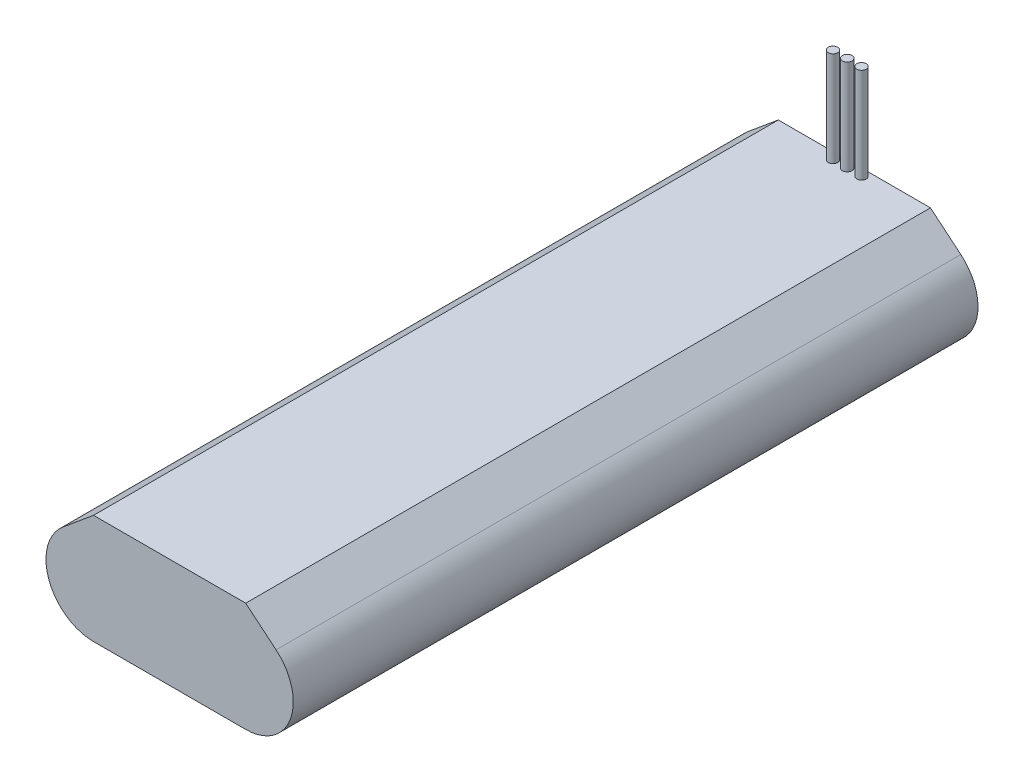
ISO-10303-21;
HEADER;
FILE_DESCRIPTION(('STEP AP214'),'2;1');
FILE_NAME('part.step','',(''),(''),'','','');
FILE_SCHEMA(('AUTOMOTIVE_DESIGN { 1 0 10303 214 1 1 1 1 }'));
ENDSEC;
DATA;
#1=APPLICATION_CONTEXT('core data for automotive mechanical design processes');
#2=APPLICATION_PROTOCOL_DEFINITION('international standard','automotive_design',2000,#1);
#3=PRODUCT_CONTEXT('',#1,'mechanical');
#4=PRODUCT('Part','Part','',(#3));
#5=PRODUCT_RELATED_PRODUCT_CATEGORY('part','',(#4));
#6=PRODUCT_DEFINITION_FORMATION('','',#4);
#7=PRODUCT_DEFINITION_CONTEXT('part definition',#1,'design');
#8=PRODUCT_DEFINITION('design','',#6,#7);
#9=PRODUCT_DEFINITION_SHAPE('','',#8);
#10=(LENGTH_UNIT() NAMED_UNIT(*) SI_UNIT(.MILLI.,.METRE.));
#11=(NAMED_UNIT(*) PLANE_ANGLE_UNIT() SI_UNIT($,.RADIAN.));
#12=(NAMED_UNIT(*) SI_UNIT($,.STERADIAN.) SOLID_ANGLE_UNIT());
#13=UNCERTAINTY_MEASURE_WITH_UNIT(LENGTH_MEASURE(1.E-05),#10,'distance_accuracy_value','');
#14=(GEOMETRIC_REPRESENTATION_CONTEXT(3) GLOBAL_UNCERTAINTY_ASSIGNED_CONTEXT((#13)) GLOBAL_UNIT_ASSIGNED_CONTEXT((#10,
#11,#12)) REPRESENTATION_CONTEXT('',''));
#15=CARTESIAN_POINT('',(0.,0.,0.));
#16=DIRECTION('',(0.,0.,1.));
#17=DIRECTION('',(1.,0.,0.));
#18=AXIS2_PLACEMENT_3D('',#15,#16,#17);
#19=CARTESIAN_POINT('',(-16.,0.,144.));
#20=DIRECTION('',(0.,0.,-1.));
#21=DIRECTION('',(-1.,0.,0.));
#22=AXIS2_PLACEMENT_3D('',#19,#20,#21);
#23=CYLINDRICAL_SURFACE('',#22,10.);
#24=CARTESIAN_POINT('',(-16.,0.,0.));
#25=DIRECTION('',(0.,0.,1.));
#26=DIRECTION('',(1.,0.,0.));
#27=AXIS2_PLACEMENT_3D('',#24,#25,#26);
#28=CIRCLE('',#27,10.);
#29=CARTESIAN_POINT('',(-22.3897106637831,7.69230769230769,0.));
#30=VERTEX_POINT('',#29);
#31=CARTESIAN_POINT('',(-16.,-10.,0.));
#32=VERTEX_POINT('',#31);
#33=EDGE_CURVE('E130',#30,#32,#28,.T.);
#34=ORIENTED_EDGE('',*,*,#33,.T.);
#35=DIRECTION('',(0.,0.,-1.));
#36=VECTOR('',#35,1.);
#37=CARTESIAN_POINT('',(-16.,-10.,144.));
#38=LINE('',#37,#36);
#39=CARTESIAN_POINT('',(-16.,-10.,144.));
#40=VERTEX_POINT('',#39);
#41=EDGE_CURVE('E148',#40,#32,#38,.T.);
#42=ORIENTED_EDGE('',*,*,#41,.F.);
#43=CARTESIAN_POINT('',(-16.,0.,144.));
#44=DIRECTION('',(0.,0.,1.));
#45=DIRECTION('',(1.,0.,0.));
#46=AXIS2_PLACEMENT_3D('',#43,#44,#45);
#47=CIRCLE('',#46,10.);
#48=CARTESIAN_POINT('',(-22.3897106637831,7.69230769230769,144.));
#49=VERTEX_POINT('',#48);
#50=EDGE_CURVE('E141',#49,#40,#47,.T.);
#51=ORIENTED_EDGE('',*,*,#50,.F.);
#52=DIRECTION('',(0.,0.,-1.));
#53=VECTOR('',#52,1.);
#54=CARTESIAN_POINT('',(-22.3897106637831,7.69230769230769,144.));
#55=LINE('',#54,#53);
#56=EDGE_CURVE('E126',#49,#30,#55,.T.);
#57=ORIENTED_EDGE('',*,*,#56,.T.);
#58=EDGE_LOOP('',(#34,#42,#51,#57));
#59=FACE_BOUND('',#58,.T.);
#60=ADVANCED_FACE('F45',(#59),#23,.T.);
#61=CARTESIAN_POINT('',(-16.,-10.,144.));
#62=DIRECTION('',(0.,1.,0.));
#63=DIRECTION('',(-1.,0.,0.));
#64=AXIS2_PLACEMENT_3D('',#61,#62,#63);
#65=PLANE('',#64);
#66=DIRECTION('',(1.,0.,0.));
#67=VECTOR('',#66,1.);
#68=CARTESIAN_POINT('',(-16.,-10.,0.));
#69=LINE('',#68,#67);
#70=CARTESIAN_POINT('',(16.,-9.99999999999999,0.));
#71=VERTEX_POINT('',#70);
#72=EDGE_CURVE('E133',#32,#71,#69,.T.);
#73=ORIENTED_EDGE('',*,*,#72,.T.);
#74=DIRECTION('',(0.,0.,-1.));
#75=VECTOR('',#74,1.);
#76=CARTESIAN_POINT('',(16.,-9.99999999999999,144.));
#77=LINE('',#76,#75);
#78=CARTESIAN_POINT('',(16.,-9.99999999999999,144.));
#79=VERTEX_POINT('',#78);
#80=EDGE_CURVE('E145',#79,#71,#77,.T.);
#81=ORIENTED_EDGE('',*,*,#80,.F.);
#82=DIRECTION('',(1.,0.,0.));
#83=VECTOR('',#82,1.);
#84=CARTESIAN_POINT('',(-16.,-10.,144.));
#85=LINE('',#84,#83);
#86=EDGE_CURVE('E99',#40,#79,#85,.T.);
#87=ORIENTED_EDGE('',*,*,#86,.F.);
#88=ORIENTED_EDGE('',*,*,#41,.T.);
#89=EDGE_LOOP('',(#73,#81,#87,#88));
#90=FACE_BOUND('',#89,.T.);
#91=ADVANCED_FACE('F181',(#90),#65,.F.);
#92=CARTESIAN_POINT('',(16.,0.,144.));
#93=DIRECTION('',(0.,0.,-1.));
#94=DIRECTION('',(-1.,0.,0.));
#95=AXIS2_PLACEMENT_3D('',#92,#93,#94);
#96=CYLINDRICAL_SURFACE('',#95,10.);
#97=CARTESIAN_POINT('',(16.,0.,0.));
#98=DIRECTION('',(0.,0.,1.));
#99=DIRECTION('',(1.,0.,0.));
#100=AXIS2_PLACEMENT_3D('',#97,#98,#99);
#101=CIRCLE('',#100,10.);
#102=CARTESIAN_POINT('',(22.3897130497335,7.69230571038786,0.));
#103=VERTEX_POINT('',#102);
#104=EDGE_CURVE('E136',#71,#103,#101,.T.);
#105=ORIENTED_EDGE('',*,*,#104,.T.);
#106=DIRECTION('',(0.,0.,-1.));
#107=VECTOR('',#106,1.);
#108=CARTESIAN_POINT('',(22.3897130497335,7.69230571038786,144.));
#109=LINE('',#108,#107);
#110=CARTESIAN_POINT('',(22.3897130497335,7.69230571038786,144.));
#111=VERTEX_POINT('',#110);
#112=EDGE_CURVE('E121',#111,#103,#109,.T.);
#113=ORIENTED_EDGE('',*,*,#112,.F.);
#114=CARTESIAN_POINT('',(16.,0.,144.));
#115=DIRECTION('',(0.,0.,1.));
#116=DIRECTION('',(1.,0.,0.));
#117=AXIS2_PLACEMENT_3D('',#114,#115,#116);
#118=CIRCLE('',#117,10.);
#119=EDGE_CURVE('E112',#79,#111,#118,.T.);
#120=ORIENTED_EDGE('',*,*,#119,.F.);
#121=ORIENTED_EDGE('',*,*,#80,.T.);
#122=EDGE_LOOP('',(#105,#113,#120,#121));
#123=FACE_BOUND('',#122,.T.);
#124=ADVANCED_FACE('F186',(#123),#96,.T.);
#125=CARTESIAN_POINT('',(16.0000040322559,13.,144.));
#126=DIRECTION('',(-0.638971304973349,-0.769230571038785,0.));
#127=DIRECTION('',(0.769230571038785,-0.638971304973349,0.));
#128=AXIS2_PLACEMENT_3D('',#125,#126,#127);
#129=PLANE('',#128);
#130=DIRECTION('',(-0.769230571038785,0.638971304973349,0.));
#131=VECTOR('',#130,1.);
#132=CARTESIAN_POINT('',(16.0000040322559,13.,0.));
#133=LINE('',#132,#131);
#134=CARTESIAN_POINT('',(16.0000040322559,13.,0.));
#135=VERTEX_POINT('',#134);
#136=EDGE_CURVE('E120',#103,#135,#133,.T.);
#137=ORIENTED_EDGE('',*,*,#136,.T.);
#138=DIRECTION('',(0.,0.,-1.));
#139=VECTOR('',#138,1.);
#140=CARTESIAN_POINT('',(16.0000040322559,13.,144.));
#141=LINE('',#140,#139);
#142=CARTESIAN_POINT('',(16.0000040322559,13.,144.));
#143=VERTEX_POINT('',#142);
#144=EDGE_CURVE('E117',#143,#135,#141,.T.);
#145=ORIENTED_EDGE('',*,*,#144,.F.);
#146=DIRECTION('',(-0.769230571038785,0.638971304973349,0.));
#147=VECTOR('',#146,1.);
#148=CARTESIAN_POINT('',(16.0000040322559,13.,144.));
#149=LINE('',#148,#147);
#150=EDGE_CURVE('E106',#111,#143,#149,.T.);
#151=ORIENTED_EDGE('',*,*,#150,.F.);
#152=ORIENTED_EDGE('',*,*,#112,.T.);
#153=EDGE_LOOP('',(#137,#145,#151,#152));
#154=FACE_BOUND('',#153,.T.);
#155=ADVANCED_FACE('F118',(#154),#129,.F.);
#156=CARTESIAN_POINT('',(-16.,13.,144.));
#157=DIRECTION('',(0.,-1.,0.));
#158=DIRECTION('',(0.,0.,-1.));
#159=AXIS2_PLACEMENT_3D('',#156,#157,#158);
#160=PLANE('',#159);
#161=CARTESIAN_POINT('',(3.,13.,1.5));
#162=DIRECTION('',(0.,-1.,0.));
#163=DIRECTION('',(0.,0.,-1.));
#164=AXIS2_PLACEMENT_3D('',#161,#162,#163);
#165=CIRCLE('',#164,1.);
#166=CARTESIAN_POINT('',(3.,13.,0.500000000000003));
#167=VERTEX_POINT('',#166);
#168=EDGE_CURVE('E11',#167,#167,#165,.F.);
#169=ORIENTED_EDGE('',*,*,#168,.F.);
#170=EDGE_LOOP('',(#169));
#171=FACE_BOUND('',#170,.T.);
#172=CARTESIAN_POINT('',(0.,13.,1.5));
#173=DIRECTION('',(0.,-1.,0.));
#174=DIRECTION('',(0.,0.,-1.));
#175=AXIS2_PLACEMENT_3D('',#172,#173,#174);
#176=CIRCLE('',#175,1.);
#177=CARTESIAN_POINT('',(0.,13.,0.500000000000003));
#178=VERTEX_POINT('',#177);
#179=EDGE_CURVE('E53',#178,#178,#176,.F.);
#180=ORIENTED_EDGE('',*,*,#179,.F.);
#181=EDGE_LOOP('',(#180));
#182=FACE_BOUND('',#181,.T.);
#183=CARTESIAN_POINT('',(-3.,13.,1.5));
#184=DIRECTION('',(0.,-1.,0.));
#185=DIRECTION('',(0.,0.,-1.));
#186=AXIS2_PLACEMENT_3D('',#183,#184,#185);
#187=CIRCLE('',#186,1.);
#188=CARTESIAN_POINT('',(-3.,13.,0.500000000000003));
#189=VERTEX_POINT('',#188);
#190=EDGE_CURVE('E150',#189,#189,#187,.F.);
#191=ORIENTED_EDGE('',*,*,#190,.F.);
#192=EDGE_LOOP('',(#191));
#193=FACE_BOUND('',#192,.T.);
#194=DIRECTION('',(-1.,0.,0.));
#195=VECTOR('',#194,1.);
#196=CARTESIAN_POINT('',(-16.,13.,0.));
#197=LINE('',#196,#195);
#198=CARTESIAN_POINT('',(-16.,13.,0.));
#199=VERTEX_POINT('',#198);
#200=EDGE_CURVE('E84',#135,#199,#197,.T.);
#201=ORIENTED_EDGE('',*,*,#200,.T.);
#202=DIRECTION('',(0.,0.,-1.));
#203=VECTOR('',#202,1.);
#204=CARTESIAN_POINT('',(-16.,13.,144.));
#205=LINE('',#204,#203);
#206=CARTESIAN_POINT('',(-16.,13.,144.));
#207=VERTEX_POINT('',#206);
#208=EDGE_CURVE('E122',#207,#199,#205,.T.);
#209=ORIENTED_EDGE('',*,*,#208,.F.);
#210=DIRECTION('',(-1.,0.,0.));
#211=VECTOR('',#210,1.);
#212=CARTESIAN_POINT('',(-16.,13.,144.));
#213=LINE('',#212,#211);
#214=EDGE_CURVE('E110',#143,#207,#213,.T.);
#215=ORIENTED_EDGE('',*,*,#214,.F.);
#216=ORIENTED_EDGE('',*,*,#144,.T.);
#217=EDGE_LOOP('',(#201,#209,#215,#216));
#218=FACE_BOUND('',#217,.T.);
#219=ADVANCED_FACE('F124',(#171,#182,#193,#218),#160,.F.);
#220=CARTESIAN_POINT('',(-16.,13.,144.));
#221=DIRECTION('',(0.638971066378314,-0.769230769230769,0.));
#222=DIRECTION('',(0.769230769230769,0.638971066378314,0.));
#223=AXIS2_PLACEMENT_3D('',#220,#221,#222);
#224=PLANE('',#223);
#225=DIRECTION('',(-0.769230769230769,-0.638971066378314,0.));
#226=VECTOR('',#225,1.);
#227=CARTESIAN_POINT('',(-16.,13.,0.));
#228=LINE('',#227,#226);
#229=EDGE_CURVE('E90',#199,#30,#228,.T.);
#230=ORIENTED_EDGE('',*,*,#229,.T.);
#231=ORIENTED_EDGE('',*,*,#56,.F.);
#232=DIRECTION('',(-0.769230769230769,-0.638971066378314,0.));
#233=VECTOR('',#232,1.);
#234=CARTESIAN_POINT('',(-16.,13.,144.));
#235=LINE('',#234,#233);
#236=EDGE_CURVE('E61',#207,#49,#235,.T.);
#237=ORIENTED_EDGE('',*,*,#236,.F.);
#238=ORIENTED_EDGE('',*,*,#208,.T.);
#239=EDGE_LOOP('',(#230,#231,#237,#238));
#240=FACE_BOUND('',#239,.T.);
#241=ADVANCED_FACE('F159',(#240),#224,.F.);
#242=CARTESIAN_POINT('',(-16.,0.,144.));
#243=DIRECTION('',(0.,0.,1.));
#244=DIRECTION('',(1.,0.,0.));
#245=AXIS2_PLACEMENT_3D('',#242,#243,#244);
#246=PLANE('',#245);
#247=ORIENTED_EDGE('',*,*,#50,.T.);
#248=ORIENTED_EDGE('',*,*,#86,.T.);
#249=ORIENTED_EDGE('',*,*,#119,.T.);
#250=ORIENTED_EDGE('',*,*,#150,.T.);
#251=ORIENTED_EDGE('',*,*,#214,.T.);
#252=ORIENTED_EDGE('',*,*,#236,.T.);
#253=EDGE_LOOP('',(#247,#248,#249,#250,#251,#252));
#254=FACE_BOUND('',#253,.T.);
#255=ADVANCED_FACE('F108',(#254),#246,.T.);
#256=CARTESIAN_POINT('',(-16.,0.,0.));
#257=DIRECTION('',(0.,0.,1.));
#258=DIRECTION('',(1.,0.,0.));
#259=AXIS2_PLACEMENT_3D('',#256,#257,#258);
#260=PLANE('',#259);
#261=ORIENTED_EDGE('',*,*,#33,.F.);
#262=ORIENTED_EDGE('',*,*,#229,.F.);
#263=ORIENTED_EDGE('',*,*,#200,.F.);
#264=ORIENTED_EDGE('',*,*,#136,.F.);
#265=ORIENTED_EDGE('',*,*,#104,.F.);
#266=ORIENTED_EDGE('',*,*,#72,.F.);
#267=EDGE_LOOP('',(#261,#262,#263,#264,#265,#266));
#268=FACE_BOUND('',#267,.T.);
#269=ADVANCED_FACE('F167',(#268),#260,.F.);
#270=CARTESIAN_POINT('',(-3.,33.,1.5));
#271=DIRECTION('',(0.,-1.,0.));
#272=DIRECTION('',(0.,0.,-1.));
#273=AXIS2_PLACEMENT_3D('',#270,#271,#272);
#274=CYLINDRICAL_SURFACE('',#273,1.);
#275=CARTESIAN_POINT('',(-3.,33.,1.5));
#276=DIRECTION('',(0.,1.,0.));
#277=DIRECTION('',(0.,0.,1.));
#278=AXIS2_PLACEMENT_3D('',#275,#276,#277);
#279=CIRCLE('',#278,1.);
#280=CARTESIAN_POINT('',(-3.,33.,2.5));
#281=VERTEX_POINT('',#280);
#282=EDGE_CURVE('E134',#281,#281,#279,.T.);
#283=ORIENTED_EDGE('',*,*,#282,.F.);
#284=EDGE_LOOP('',(#283));
#285=FACE_BOUND('',#284,.T.);
#286=ORIENTED_EDGE('',*,*,#190,.T.);
#287=EDGE_LOOP('',(#286));
#288=FACE_BOUND('',#287,.T.);
#289=ADVANCED_FACE('F164',(#285,#288),#274,.T.);
#290=CARTESIAN_POINT('',(-3.,33.,1.5));
#291=DIRECTION('',(0.,1.,0.));
#292=DIRECTION('',(0.,0.,1.));
#293=AXIS2_PLACEMENT_3D('',#290,#291,#292);
#294=PLANE('',#293);
#295=ORIENTED_EDGE('',*,*,#282,.T.);
#296=EDGE_LOOP('',(#295));
#297=FACE_BOUND('',#296,.T.);
#298=ADVANCED_FACE('F166',(#297),#294,.T.);
#299=CARTESIAN_POINT('',(0.,33.,1.5));
#300=DIRECTION('',(0.,-1.,0.));
#301=DIRECTION('',(0.,0.,-1.));
#302=AXIS2_PLACEMENT_3D('',#299,#300,#301);
#303=CYLINDRICAL_SURFACE('',#302,1.);
#304=CARTESIAN_POINT('',(0.,33.,1.5));
#305=DIRECTION('',(0.,1.,0.));
#306=DIRECTION('',(0.,0.,1.));
#307=AXIS2_PLACEMENT_3D('',#304,#305,#306);
#308=CIRCLE('',#307,1.);
#309=CARTESIAN_POINT('',(0.,33.,2.5));
#310=VERTEX_POINT('',#309);
#311=EDGE_CURVE('E197',#310,#310,#308,.T.);
#312=ORIENTED_EDGE('',*,*,#311,.F.);
#313=EDGE_LOOP('',(#312));
#314=FACE_BOUND('',#313,.T.);
#315=ORIENTED_EDGE('',*,*,#179,.T.);
#316=EDGE_LOOP('',(#315));
#317=FACE_BOUND('',#316,.T.);
#318=ADVANCED_FACE('F155',(#314,#317),#303,.T.);
#319=CARTESIAN_POINT('',(0.,33.,1.5));
#320=DIRECTION('',(0.,1.,0.));
#321=DIRECTION('',(0.,0.,1.));
#322=AXIS2_PLACEMENT_3D('',#319,#320,#321);
#323=PLANE('',#322);
#324=ORIENTED_EDGE('',*,*,#311,.T.);
#325=EDGE_LOOP('',(#324));
#326=FACE_BOUND('',#325,.T.);
#327=ADVANCED_FACE('F209',(#326),#323,.T.);
#328=CARTESIAN_POINT('',(3.,33.,1.5));
#329=DIRECTION('',(0.,-1.,0.));
#330=DIRECTION('',(0.,0.,-1.));
#331=AXIS2_PLACEMENT_3D('',#328,#329,#330);
#332=CYLINDRICAL_SURFACE('',#331,1.);
#333=CARTESIAN_POINT('',(3.,33.,1.5));
#334=DIRECTION('',(0.,1.,0.));
#335=DIRECTION('',(0.,0.,1.));
#336=AXIS2_PLACEMENT_3D('',#333,#334,#335);
#337=CIRCLE('',#336,1.);
#338=CARTESIAN_POINT('',(3.,33.,2.5));
#339=VERTEX_POINT('',#338);
#340=EDGE_CURVE('E200',#339,#339,#337,.T.);
#341=ORIENTED_EDGE('',*,*,#340,.F.);
#342=EDGE_LOOP('',(#341));
#343=FACE_BOUND('',#342,.T.);
#344=ORIENTED_EDGE('',*,*,#168,.T.);
#345=EDGE_LOOP('',(#344));
#346=FACE_BOUND('',#345,.T.);
#347=ADVANCED_FACE('F206',(#343,#346),#332,.T.);
#348=CARTESIAN_POINT('',(3.,33.,1.5));
#349=DIRECTION('',(0.,1.,0.));
#350=DIRECTION('',(0.,0.,1.));
#351=AXIS2_PLACEMENT_3D('',#348,#349,#350);
#352=PLANE('',#351);
#353=ORIENTED_EDGE('',*,*,#340,.T.);
#354=EDGE_LOOP('',(#353));
#355=FACE_BOUND('',#354,.T.);
#356=ADVANCED_FACE('F204',(#355),#352,.T.);
#357=CLOSED_SHELL('',(#60,#91,#124,#155,#219,#241,#255,#269,#289,#298,#318,#327,#347,#356));
#358=MANIFOLD_SOLID_BREP('B2',#357);
#359=ADVANCED_BREP_SHAPE_REPRESENTATION('',(#18,#358),#14);
#360=SHAPE_DEFINITION_REPRESENTATION(#9,#359);
ENDSEC;
END-ISO-10303-21;
